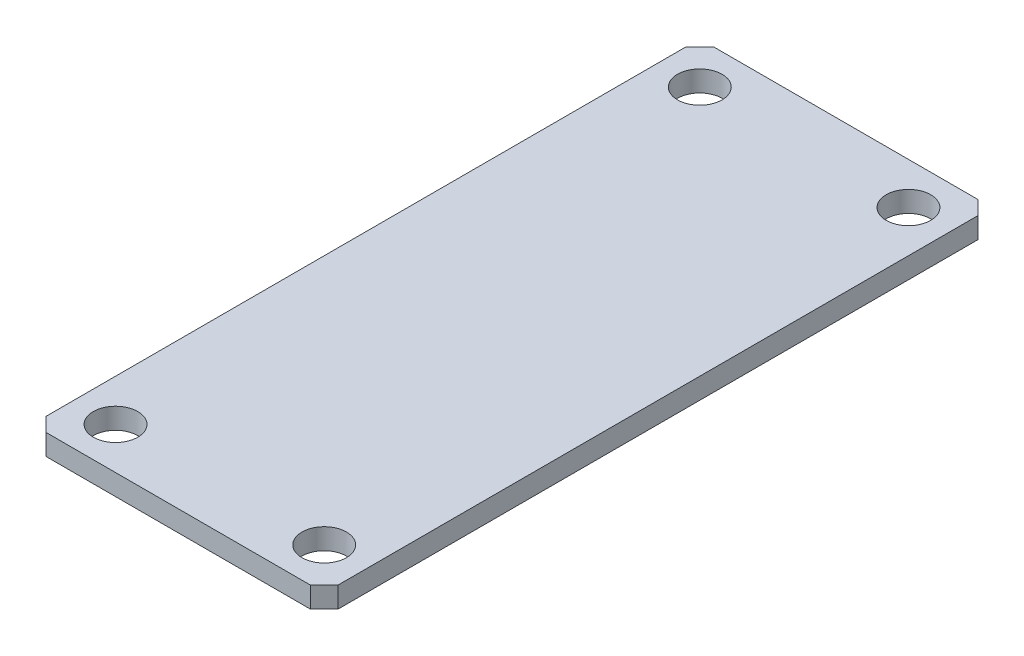
ISO-10303-21;
HEADER;
FILE_DESCRIPTION(('STEP AP214'),'2;1');
FILE_NAME('part.step','',(''),(''),'','','');
FILE_SCHEMA(('AUTOMOTIVE_DESIGN { 1 0 10303 214 1 1 1 1 }'));
ENDSEC;
DATA;
#1=APPLICATION_CONTEXT('core data for automotive mechanical design processes');
#2=APPLICATION_PROTOCOL_DEFINITION('international standard','automotive_design',2000,#1);
#3=PRODUCT_CONTEXT('',#1,'mechanical');
#4=PRODUCT('Part','Part','',(#3));
#5=PRODUCT_RELATED_PRODUCT_CATEGORY('part','',(#4));
#6=PRODUCT_DEFINITION_FORMATION('','',#4);
#7=PRODUCT_DEFINITION_CONTEXT('part definition',#1,'design');
#8=PRODUCT_DEFINITION('design','',#6,#7);
#9=PRODUCT_DEFINITION_SHAPE('','',#8);
#10=(LENGTH_UNIT() NAMED_UNIT(*) SI_UNIT(.MILLI.,.METRE.));
#11=(NAMED_UNIT(*) PLANE_ANGLE_UNIT() SI_UNIT($,.RADIAN.));
#12=(NAMED_UNIT(*) SI_UNIT($,.STERADIAN.) SOLID_ANGLE_UNIT());
#13=UNCERTAINTY_MEASURE_WITH_UNIT(LENGTH_MEASURE(1.E-05),#10,'distance_accuracy_value','');
#14=(GEOMETRIC_REPRESENTATION_CONTEXT(3) GLOBAL_UNCERTAINTY_ASSIGNED_CONTEXT((#13)) GLOBAL_UNIT_ASSIGNED_CONTEXT((#10,
#11,#12)) REPRESENTATION_CONTEXT('',''));
#15=CARTESIAN_POINT('',(0.,0.,0.));
#16=DIRECTION('',(0.,0.,1.));
#17=DIRECTION('',(1.,0.,0.));
#18=AXIS2_PLACEMENT_3D('',#15,#16,#17);
#19=CARTESIAN_POINT('',(9.49999999984079,32.5,4.99999999882991));
#20=DIRECTION('',(4.5527269819515E-11,0.,1.));
#21=DIRECTION('',(1.,0.,-4.5527269819515E-11));
#22=AXIS2_PLACEMENT_3D('',#19,#20,#21);
#23=PLANE('',#22);
#24=DIRECTION('',(-1.,0.,4.5527269819515E-11));
#25=VECTOR('',#24,1.);
#26=CARTESIAN_POINT('',(9.49999999984079,31.,4.99999999882991));
#27=LINE('',#26,#25);
#28=CARTESIAN_POINT('',(9.49999999984079,31.,4.99999999882991));
#29=VERTEX_POINT('',#28);
#30=CARTESIAN_POINT('',(-9.5000000001938,31.,4.99999999969492));
#31=VERTEX_POINT('',#30);
#32=EDGE_CURVE('E124',#29,#31,#27,.T.);
#33=ORIENTED_EDGE('',*,*,#32,.T.);
#34=DIRECTION('',(0.,-1.,0.));
#35=VECTOR('',#34,1.);
#36=CARTESIAN_POINT('',(-9.5000000001938,32.5,4.99999999969492));
#37=LINE('',#36,#35);
#38=CARTESIAN_POINT('',(-9.5000000001938,32.5,4.99999999969492));
#39=VERTEX_POINT('',#38);
#40=EDGE_CURVE('E11',#39,#31,#37,.T.);
#41=ORIENTED_EDGE('',*,*,#40,.F.);
#42=DIRECTION('',(-1.,0.,4.5527269819515E-11));
#43=VECTOR('',#42,1.);
#44=CARTESIAN_POINT('',(9.49999999984079,32.5,4.99999999882991));
#45=LINE('',#44,#43);
#46=CARTESIAN_POINT('',(9.49999999984079,32.5,4.99999999882991));
#47=VERTEX_POINT('',#46);
#48=EDGE_CURVE('E145',#47,#39,#45,.T.);
#49=ORIENTED_EDGE('',*,*,#48,.F.);
#50=DIRECTION('',(0.,-1.,0.));
#51=VECTOR('',#50,1.);
#52=CARTESIAN_POINT('',(9.49999999984079,32.5,4.99999999882991));
#53=LINE('',#52,#51);
#54=EDGE_CURVE('E20',#47,#29,#53,.T.);
#55=ORIENTED_EDGE('',*,*,#54,.T.);
#56=EDGE_LOOP('',(#33,#41,#49,#55));
#57=FACE_BOUND('',#56,.T.);
#58=ADVANCED_FACE('F17',(#57),#23,.F.);
#59=CARTESIAN_POINT('',(-9.5000000001938,32.5,4.99999999969493));
#60=DIRECTION('',(0.707106781202644,0.,0.707106781170451));
#61=DIRECTION('',(0.707106781170451,0.,-0.707106781202644));
#62=AXIS2_PLACEMENT_3D('',#59,#60,#61);
#63=PLANE('',#62);
#64=DIRECTION('',(-0.707106781170451,0.,0.707106781202644));
#65=VECTOR('',#64,1.);
#66=CARTESIAN_POINT('',(-9.5000000001938,31.,4.99999999969493));
#67=LINE('',#66,#65);
#68=CARTESIAN_POINT('',(-10.5000000001483,31.,5.99999999969493));
#69=VERTEX_POINT('',#68);
#70=EDGE_CURVE('E128',#31,#69,#67,.T.);
#71=ORIENTED_EDGE('',*,*,#70,.T.);
#72=DIRECTION('',(0.,-1.,0.));
#73=VECTOR('',#72,1.);
#74=CARTESIAN_POINT('',(-10.5000000001483,32.5,5.99999999969493));
#75=LINE('',#74,#73);
#76=CARTESIAN_POINT('',(-10.5000000001483,32.5,5.99999999969493));
#77=VERTEX_POINT('',#76);
#78=EDGE_CURVE('E27',#77,#69,#75,.T.);
#79=ORIENTED_EDGE('',*,*,#78,.F.);
#80=DIRECTION('',(-0.707106781170451,0.,0.707106781202644));
#81=VECTOR('',#80,1.);
#82=CARTESIAN_POINT('',(-9.5000000001938,32.5,4.99999999969493));
#83=LINE('',#82,#81);
#84=EDGE_CURVE('E178',#39,#77,#83,.T.);
#85=ORIENTED_EDGE('',*,*,#84,.F.);
#86=ORIENTED_EDGE('',*,*,#40,.T.);
#87=EDGE_LOOP('',(#71,#79,#85,#86));
#88=FACE_BOUND('',#87,.T.);
#89=ADVANCED_FACE('F232',(#88),#63,.F.);
#90=CARTESIAN_POINT('',(-10.5000000001483,32.5,5.99999999969493));
#91=DIRECTION('',(1.,0.,0.));
#92=DIRECTION('',(0.,0.,-1.));
#93=AXIS2_PLACEMENT_3D('',#90,#91,#92);
#94=PLANE('',#93);
#95=DIRECTION('',(0.,0.,1.));
#96=VECTOR('',#95,1.);
#97=CARTESIAN_POINT('',(-10.5000000001483,31.,5.99999999969493));
#98=LINE('',#97,#96);
#99=CARTESIAN_POINT('',(-10.5000000001483,31.,52.000000000078));
#100=VERTEX_POINT('',#99);
#101=EDGE_CURVE('E132',#69,#100,#98,.T.);
#102=ORIENTED_EDGE('',*,*,#101,.T.);
#103=DIRECTION('',(0.,-1.,0.));
#104=VECTOR('',#103,1.);
#105=CARTESIAN_POINT('',(-10.5000000001483,32.5,52.000000000078));
#106=LINE('',#105,#104);
#107=CARTESIAN_POINT('',(-10.5000000001483,32.5,52.000000000078));
#108=VERTEX_POINT('',#107);
#109=EDGE_CURVE('E153',#108,#100,#106,.T.);
#110=ORIENTED_EDGE('',*,*,#109,.F.);
#111=DIRECTION('',(0.,0.,1.));
#112=VECTOR('',#111,1.);
#113=CARTESIAN_POINT('',(-10.5000000001483,32.5,5.99999999969493));
#114=LINE('',#113,#112);
#115=EDGE_CURVE('E167',#77,#108,#114,.T.);
#116=ORIENTED_EDGE('',*,*,#115,.F.);
#117=ORIENTED_EDGE('',*,*,#78,.T.);
#118=EDGE_LOOP('',(#102,#110,#116,#117));
#119=FACE_BOUND('',#118,.T.);
#120=ADVANCED_FACE('F165',(#119),#94,.F.);
#121=CARTESIAN_POINT('',(-10.5000000001483,32.5,52.000000000078));
#122=DIRECTION('',(0.707106781184425,0.,-0.70710678118867));
#123=DIRECTION('',(-0.70710678118867,0.,-0.707106781184425));
#124=AXIS2_PLACEMENT_3D('',#121,#122,#123);
#125=PLANE('',#124);
#126=DIRECTION('',(0.70710678118867,0.,0.707106781184425));
#127=VECTOR('',#126,1.);
#128=CARTESIAN_POINT('',(-10.5000000001483,31.,52.000000000078));
#129=LINE('',#128,#127);
#130=CARTESIAN_POINT('',(-9.50000000014228,31.,53.000000000078));
#131=VERTEX_POINT('',#130);
#132=EDGE_CURVE('E135',#100,#131,#129,.T.);
#133=ORIENTED_EDGE('',*,*,#132,.T.);
#134=DIRECTION('',(0.,-1.,0.));
#135=VECTOR('',#134,1.);
#136=CARTESIAN_POINT('',(-9.50000000014228,32.5,53.000000000078));
#137=LINE('',#136,#135);
#138=CARTESIAN_POINT('',(-9.50000000014228,32.5,53.000000000078));
#139=VERTEX_POINT('',#138);
#140=EDGE_CURVE('E108',#139,#131,#137,.T.);
#141=ORIENTED_EDGE('',*,*,#140,.F.);
#142=DIRECTION('',(0.70710678118867,0.,0.707106781184425));
#143=VECTOR('',#142,1.);
#144=CARTESIAN_POINT('',(-10.5000000001483,32.5,52.000000000078));
#145=LINE('',#144,#143);
#146=EDGE_CURVE('E97',#108,#139,#145,.T.);
#147=ORIENTED_EDGE('',*,*,#146,.F.);
#148=ORIENTED_EDGE('',*,*,#109,.T.);
#149=EDGE_LOOP('',(#133,#141,#147,#148));
#150=FACE_BOUND('',#149,.T.);
#151=ADVANCED_FACE('F174',(#150),#125,.F.);
#152=CARTESIAN_POINT('',(-9.50000000014229,32.5,53.000000000078));
#153=DIRECTION('',(-6.00433445648879E-12,0.,-1.));
#154=DIRECTION('',(-1.,0.,6.00433445648879E-12));
#155=AXIS2_PLACEMENT_3D('',#152,#153,#154);
#156=PLANE('',#155);
#157=DIRECTION('',(1.,0.,-6.00433445648879E-12));
#158=VECTOR('',#157,1.);
#159=CARTESIAN_POINT('',(-9.50000000014229,31.,53.000000000078));
#160=LINE('',#159,#158);
#161=CARTESIAN_POINT('',(9.49999999999956,31.,52.9999999999639));
#162=VERTEX_POINT('',#161);
#163=EDGE_CURVE('E106',#131,#162,#160,.T.);
#164=ORIENTED_EDGE('',*,*,#163,.T.);
#165=DIRECTION('',(0.,-1.,0.));
#166=VECTOR('',#165,1.);
#167=CARTESIAN_POINT('',(9.49999999999956,32.5,52.9999999999639));
#168=LINE('',#167,#166);
#169=CARTESIAN_POINT('',(9.49999999999956,32.5,52.9999999999639));
#170=VERTEX_POINT('',#169);
#171=EDGE_CURVE('E103',#170,#162,#168,.T.);
#172=ORIENTED_EDGE('',*,*,#171,.F.);
#173=DIRECTION('',(1.,0.,-6.00433445648879E-12));
#174=VECTOR('',#173,1.);
#175=CARTESIAN_POINT('',(-9.50000000014229,32.5,53.000000000078));
#176=LINE('',#175,#174);
#177=EDGE_CURVE('E91',#139,#170,#176,.T.);
#178=ORIENTED_EDGE('',*,*,#177,.F.);
#179=ORIENTED_EDGE('',*,*,#140,.T.);
#180=EDGE_LOOP('',(#164,#172,#178,#179));
#181=FACE_BOUND('',#180,.T.);
#182=ADVANCED_FACE('F104',(#181),#156,.F.);
#183=CARTESIAN_POINT('',(9.49999999999956,32.5,52.9999999999639));
#184=DIRECTION('',(-0.707106781189495,0.,-0.7071067811836));
#185=DIRECTION('',(-0.7071067811836,0.,0.707106781189495));
#186=AXIS2_PLACEMENT_3D('',#183,#184,#185);
#187=PLANE('',#186);
#188=DIRECTION('',(0.7071067811836,0.,-0.707106781189495));
#189=VECTOR('',#188,1.);
#190=CARTESIAN_POINT('',(9.49999999999956,31.,52.9999999999639));
#191=LINE('',#190,#189);
#192=CARTESIAN_POINT('',(10.4999999999936,31.,51.9999999999616));
#193=VERTEX_POINT('',#192);
#194=EDGE_CURVE('E64',#162,#193,#191,.T.);
#195=ORIENTED_EDGE('',*,*,#194,.T.);
#196=DIRECTION('',(0.,-1.,0.));
#197=VECTOR('',#196,1.);
#198=CARTESIAN_POINT('',(10.4999999999936,32.5,51.9999999999616));
#199=LINE('',#198,#197);
#200=CARTESIAN_POINT('',(10.4999999999936,32.5,51.9999999999616));
#201=VERTEX_POINT('',#200);
#202=EDGE_CURVE('E109',#201,#193,#199,.T.);
#203=ORIENTED_EDGE('',*,*,#202,.F.);
#204=DIRECTION('',(0.7071067811836,0.,-0.707106781189495));
#205=VECTOR('',#204,1.);
#206=CARTESIAN_POINT('',(9.49999999999956,32.5,52.9999999999639));
#207=LINE('',#206,#205);
#208=EDGE_CURVE('E95',#170,#201,#207,.T.);
#209=ORIENTED_EDGE('',*,*,#208,.F.);
#210=ORIENTED_EDGE('',*,*,#171,.T.);
#211=EDGE_LOOP('',(#195,#203,#209,#210));
#212=FACE_BOUND('',#211,.T.);
#213=ADVANCED_FACE('F111',(#212),#187,.F.);
#214=CARTESIAN_POINT('',(10.4999999999936,32.5,51.9999999999616));
#215=DIRECTION('',(-1.,0.,2.33139292889553E-12));
#216=DIRECTION('',(2.33139292889553E-12,0.,1.));
#217=AXIS2_PLACEMENT_3D('',#214,#215,#216);
#218=PLANE('',#217);
#219=DIRECTION('',(-2.33139292889553E-12,0.,-1.));
#220=VECTOR('',#219,1.);
#221=CARTESIAN_POINT('',(10.4999999999936,31.,51.9999999999616));
#222=LINE('',#221,#220);
#223=CARTESIAN_POINT('',(10.4999999998863,31.,5.99999999882758));
#224=VERTEX_POINT('',#223);
#225=EDGE_CURVE('E70',#193,#224,#222,.T.);
#226=ORIENTED_EDGE('',*,*,#225,.T.);
#227=DIRECTION('',(0.,-1.,0.));
#228=VECTOR('',#227,1.);
#229=CARTESIAN_POINT('',(10.4999999998863,32.5,5.99999999882758));
#230=LINE('',#229,#228);
#231=CARTESIAN_POINT('',(10.4999999998863,32.5,5.99999999882758));
#232=VERTEX_POINT('',#231);
#233=EDGE_CURVE('E146',#232,#224,#230,.T.);
#234=ORIENTED_EDGE('',*,*,#233,.F.);
#235=DIRECTION('',(-2.33139292889553E-12,0.,-1.));
#236=VECTOR('',#235,1.);
#237=CARTESIAN_POINT('',(10.4999999999936,32.5,51.9999999999616));
#238=LINE('',#237,#236);
#239=EDGE_CURVE('E35',#201,#232,#238,.T.);
#240=ORIENTED_EDGE('',*,*,#239,.F.);
#241=ORIENTED_EDGE('',*,*,#202,.T.);
#242=EDGE_LOOP('',(#226,#234,#240,#241));
#243=FACE_BOUND('',#242,.T.);
#244=ADVANCED_FACE('F243',(#243),#218,.F.);
#245=CARTESIAN_POINT('',(10.4999999998863,32.5,5.99999999882757));
#246=DIRECTION('',(-0.707106781169628,0.,0.707106781203467));
#247=DIRECTION('',(0.707106781203467,0.,0.707106781169628));
#248=AXIS2_PLACEMENT_3D('',#245,#246,#247);
#249=PLANE('',#248);
#250=DIRECTION('',(-0.707106781203467,0.,-0.707106781169628));
#251=VECTOR('',#250,1.);
#252=CARTESIAN_POINT('',(10.4999999998863,31.,5.99999999882757));
#253=LINE('',#252,#251);
#254=EDGE_CURVE('E142',#224,#29,#253,.T.);
#255=ORIENTED_EDGE('',*,*,#254,.T.);
#256=ORIENTED_EDGE('',*,*,#54,.F.);
#257=DIRECTION('',(-0.707106781203467,0.,-0.707106781169628));
#258=VECTOR('',#257,1.);
#259=CARTESIAN_POINT('',(10.4999999998863,32.5,5.99999999882757));
#260=LINE('',#259,#258);
#261=EDGE_CURVE('E76',#232,#47,#260,.T.);
#262=ORIENTED_EDGE('',*,*,#261,.F.);
#263=ORIENTED_EDGE('',*,*,#233,.T.);
#264=EDGE_LOOP('',(#255,#256,#262,#263));
#265=FACE_BOUND('',#264,.T.);
#266=ADVANCED_FACE('F242',(#265),#249,.F.);
#267=CARTESIAN_POINT('',(0.,32.5,0.));
#268=DIRECTION('',(0.,1.,0.));
#269=DIRECTION('',(0.,0.,1.));
#270=AXIS2_PLACEMENT_3D('',#267,#268,#269);
#271=PLANE('',#270);
#272=CARTESIAN_POINT('',(7.4999999999889,32.5,49.9999999999669));
#273=DIRECTION('',(0.,1.,0.));
#274=DIRECTION('',(0.,0.,1.));
#275=AXIS2_PLACEMENT_3D('',#272,#273,#274);
#276=CIRCLE('',#275,1.6);
#277=CARTESIAN_POINT('',(7.4999999999889,32.5,51.5999999999669));
#278=VERTEX_POINT('',#277);
#279=EDGE_CURVE('E207',#278,#278,#276,.T.);
#280=ORIENTED_EDGE('',*,*,#279,.F.);
#281=EDGE_LOOP('',(#280));
#282=FACE_BOUND('',#281,.T.);
#283=CARTESIAN_POINT('',(-7.50000000014829,32.5,50.000000000045));
#284=DIRECTION('',(0.,1.,0.));
#285=DIRECTION('',(0.,0.,1.));
#286=AXIS2_PLACEMENT_3D('',#283,#284,#285);
#287=CIRCLE('',#286,1.6);
#288=CARTESIAN_POINT('',(-7.50000000014829,32.5,51.600000000045));
#289=VERTEX_POINT('',#288);
#290=EDGE_CURVE('E199',#289,#289,#287,.T.);
#291=ORIENTED_EDGE('',*,*,#290,.F.);
#292=EDGE_LOOP('',(#291));
#293=FACE_BOUND('',#292,.T.);
#294=CARTESIAN_POINT('',(7.4999999999073,32.5,7.99999999885267));
#295=DIRECTION('',(0.,1.,0.));
#296=DIRECTION('',(0.,0.,1.));
#297=AXIS2_PLACEMENT_3D('',#294,#295,#296);
#298=CIRCLE('',#297,1.6);
#299=CARTESIAN_POINT('',(7.4999999999073,32.5,9.59999999885267));
#300=VERTEX_POINT('',#299);
#301=EDGE_CURVE('E191',#300,#300,#298,.T.);
#302=ORIENTED_EDGE('',*,*,#301,.F.);
#303=EDGE_LOOP('',(#302));
#304=FACE_BOUND('',#303,.T.);
#305=CARTESIAN_POINT('',(-7.50000000014827,32.5,7.99999999967215));
#306=DIRECTION('',(0.,1.,0.));
#307=DIRECTION('',(0.,0.,1.));
#308=AXIS2_PLACEMENT_3D('',#305,#306,#307);
#309=CIRCLE('',#308,1.6);
#310=CARTESIAN_POINT('',(-7.50000000014827,32.5,9.59999999967215));
#311=VERTEX_POINT('',#310);
#312=EDGE_CURVE('E129',#311,#311,#309,.T.);
#313=ORIENTED_EDGE('',*,*,#312,.F.);
#314=EDGE_LOOP('',(#313));
#315=FACE_BOUND('',#314,.T.);
#316=ORIENTED_EDGE('',*,*,#48,.T.);
#317=ORIENTED_EDGE('',*,*,#84,.T.);
#318=ORIENTED_EDGE('',*,*,#115,.T.);
#319=ORIENTED_EDGE('',*,*,#146,.T.);
#320=ORIENTED_EDGE('',*,*,#177,.T.);
#321=ORIENTED_EDGE('',*,*,#208,.T.);
#322=ORIENTED_EDGE('',*,*,#239,.T.);
#323=ORIENTED_EDGE('',*,*,#261,.T.);
#324=EDGE_LOOP('',(#316,#317,#318,#319,#320,#321,#322,#323));
#325=FACE_BOUND('',#324,.T.);
#326=ADVANCED_FACE('F93',(#282,#293,#304,#315,#325),#271,.T.);
#327=CARTESIAN_POINT('',(0.,31.,0.));
#328=DIRECTION('',(0.,1.,0.));
#329=DIRECTION('',(0.,0.,1.));
#330=AXIS2_PLACEMENT_3D('',#327,#328,#329);
#331=PLANE('',#330);
#332=CARTESIAN_POINT('',(7.4999999999889,31.,49.9999999999669));
#333=DIRECTION('',(0.,1.,0.));
#334=DIRECTION('',(0.,0.,1.));
#335=AXIS2_PLACEMENT_3D('',#332,#333,#334);
#336=CIRCLE('',#335,1.6);
#337=CARTESIAN_POINT('',(7.4999999999889,31.,51.5999999999669));
#338=VERTEX_POINT('',#337);
#339=EDGE_CURVE('E211',#338,#338,#336,.T.);
#340=ORIENTED_EDGE('',*,*,#339,.T.);
#341=EDGE_LOOP('',(#340));
#342=FACE_BOUND('',#341,.T.);
#343=CARTESIAN_POINT('',(-7.50000000014829,31.,50.000000000045));
#344=DIRECTION('',(0.,1.,0.));
#345=DIRECTION('',(0.,0.,1.));
#346=AXIS2_PLACEMENT_3D('',#343,#344,#345);
#347=CIRCLE('',#346,1.6);
#348=CARTESIAN_POINT('',(-7.50000000014829,31.,51.600000000045));
#349=VERTEX_POINT('',#348);
#350=EDGE_CURVE('E203',#349,#349,#347,.T.);
#351=ORIENTED_EDGE('',*,*,#350,.T.);
#352=EDGE_LOOP('',(#351));
#353=FACE_BOUND('',#352,.T.);
#354=CARTESIAN_POINT('',(7.4999999999073,31.,7.99999999885267));
#355=DIRECTION('',(0.,1.,0.));
#356=DIRECTION('',(0.,0.,1.));
#357=AXIS2_PLACEMENT_3D('',#354,#355,#356);
#358=CIRCLE('',#357,1.6);
#359=CARTESIAN_POINT('',(7.4999999999073,31.,9.59999999885267));
#360=VERTEX_POINT('',#359);
#361=EDGE_CURVE('E195',#360,#360,#358,.T.);
#362=ORIENTED_EDGE('',*,*,#361,.T.);
#363=EDGE_LOOP('',(#362));
#364=FACE_BOUND('',#363,.T.);
#365=CARTESIAN_POINT('',(-7.50000000014827,31.,7.99999999967215));
#366=DIRECTION('',(0.,1.,0.));
#367=DIRECTION('',(0.,0.,1.));
#368=AXIS2_PLACEMENT_3D('',#365,#366,#367);
#369=CIRCLE('',#368,1.6);
#370=CARTESIAN_POINT('',(-7.50000000014827,31.,9.59999999967215));
#371=VERTEX_POINT('',#370);
#372=EDGE_CURVE('E187',#371,#371,#369,.T.);
#373=ORIENTED_EDGE('',*,*,#372,.T.);
#374=EDGE_LOOP('',(#373));
#375=FACE_BOUND('',#374,.T.);
#376=ORIENTED_EDGE('',*,*,#32,.F.);
#377=ORIENTED_EDGE('',*,*,#254,.F.);
#378=ORIENTED_EDGE('',*,*,#225,.F.);
#379=ORIENTED_EDGE('',*,*,#194,.F.);
#380=ORIENTED_EDGE('',*,*,#163,.F.);
#381=ORIENTED_EDGE('',*,*,#132,.F.);
#382=ORIENTED_EDGE('',*,*,#101,.F.);
#383=ORIENTED_EDGE('',*,*,#70,.F.);
#384=EDGE_LOOP('',(#376,#377,#378,#379,#380,#381,#382,#383));
#385=FACE_BOUND('',#384,.T.);
#386=ADVANCED_FACE('F172',(#342,#353,#364,#375,#385),#331,.F.);
#387=CARTESIAN_POINT('',(-7.50000000014827,31.,7.99999999967215));
#388=DIRECTION('',(0.,1.,0.));
#389=DIRECTION('',(0.,0.,1.));
#390=AXIS2_PLACEMENT_3D('',#387,#388,#389);
#391=CYLINDRICAL_SURFACE('',#390,1.6);
#392=ORIENTED_EDGE('',*,*,#312,.T.);
#393=EDGE_LOOP('',(#392));
#394=FACE_BOUND('',#393,.T.);
#395=ORIENTED_EDGE('',*,*,#372,.F.);
#396=EDGE_LOOP('',(#395));
#397=FACE_BOUND('',#396,.T.);
#398=ADVANCED_FACE('F317',(#394,#397),#391,.F.);
#399=CARTESIAN_POINT('',(7.4999999999073,31.,7.99999999885267));
#400=DIRECTION('',(0.,1.,0.));
#401=DIRECTION('',(0.,0.,1.));
#402=AXIS2_PLACEMENT_3D('',#399,#400,#401);
#403=CYLINDRICAL_SURFACE('',#402,1.6);
#404=ORIENTED_EDGE('',*,*,#301,.T.);
#405=EDGE_LOOP('',(#404));
#406=FACE_BOUND('',#405,.T.);
#407=ORIENTED_EDGE('',*,*,#361,.F.);
#408=EDGE_LOOP('',(#407));
#409=FACE_BOUND('',#408,.T.);
#410=ADVANCED_FACE('F228',(#406,#409),#403,.F.);
#411=CARTESIAN_POINT('',(-7.50000000014829,31.,50.000000000045));
#412=DIRECTION('',(0.,1.,0.));
#413=DIRECTION('',(0.,0.,1.));
#414=AXIS2_PLACEMENT_3D('',#411,#412,#413);
#415=CYLINDRICAL_SURFACE('',#414,1.6);
#416=ORIENTED_EDGE('',*,*,#290,.T.);
#417=EDGE_LOOP('',(#416));
#418=FACE_BOUND('',#417,.T.);
#419=ORIENTED_EDGE('',*,*,#350,.F.);
#420=EDGE_LOOP('',(#419));
#421=FACE_BOUND('',#420,.T.);
#422=ADVANCED_FACE('F221',(#418,#421),#415,.F.);
#423=CARTESIAN_POINT('',(7.4999999999889,31.,49.9999999999669));
#424=DIRECTION('',(0.,1.,0.));
#425=DIRECTION('',(0.,0.,1.));
#426=AXIS2_PLACEMENT_3D('',#423,#424,#425);
#427=CYLINDRICAL_SURFACE('',#426,1.6);
#428=ORIENTED_EDGE('',*,*,#279,.T.);
#429=EDGE_LOOP('',(#428));
#430=FACE_BOUND('',#429,.T.);
#431=ORIENTED_EDGE('',*,*,#339,.F.);
#432=EDGE_LOOP('',(#431));
#433=FACE_BOUND('',#432,.T.);
#434=ADVANCED_FACE('F219',(#430,#433),#427,.F.);
#435=CLOSED_SHELL('',(#58,#89,#120,#151,#182,#213,#244,#266,#326,#386,#398,#410,#422,#434));
#436=MANIFOLD_SOLID_BREP('B1',#435);
#437=ADVANCED_BREP_SHAPE_REPRESENTATION('',(#18,#436),#14);
#438=SHAPE_DEFINITION_REPRESENTATION(#9,#437);
ENDSEC;
END-ISO-10303-21;
